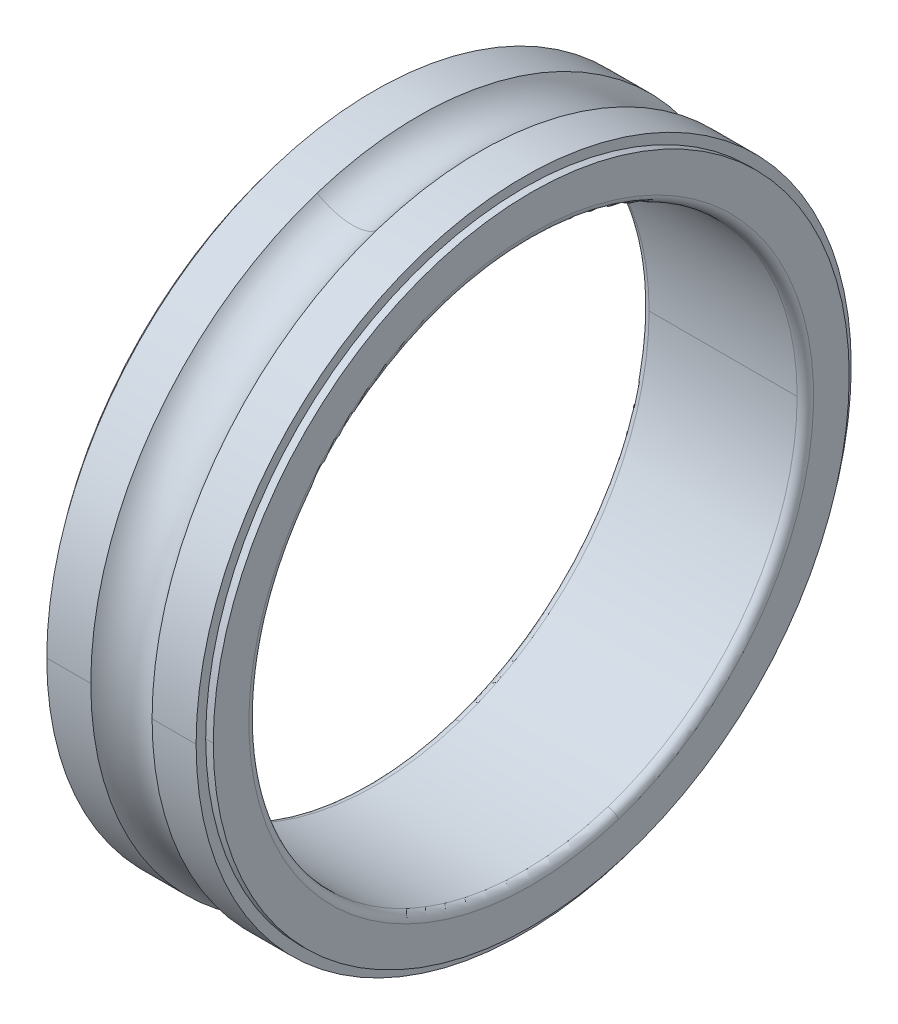
ISO-10303-21;
HEADER;
FILE_DESCRIPTION(('STEP AP214'),'2;1');
FILE_NAME('part.step','',(''),(''),'','','');
FILE_SCHEMA(('AUTOMOTIVE_DESIGN { 1 0 10303 214 1 1 1 1 }'));
ENDSEC;
DATA;
#1=APPLICATION_CONTEXT('core data for automotive mechanical design processes');
#2=APPLICATION_PROTOCOL_DEFINITION('international standard','automotive_design',2000,#1);
#3=PRODUCT_CONTEXT('',#1,'mechanical');
#4=PRODUCT('Part','Part','',(#3));
#5=PRODUCT_RELATED_PRODUCT_CATEGORY('part','',(#4));
#6=PRODUCT_DEFINITION_FORMATION('','',#4);
#7=PRODUCT_DEFINITION_CONTEXT('part definition',#1,'design');
#8=PRODUCT_DEFINITION('design','',#6,#7);
#9=PRODUCT_DEFINITION_SHAPE('','',#8);
#10=(LENGTH_UNIT() NAMED_UNIT(*) SI_UNIT(.MILLI.,.METRE.));
#11=(NAMED_UNIT(*) PLANE_ANGLE_UNIT() SI_UNIT($,.RADIAN.));
#12=(NAMED_UNIT(*) SI_UNIT($,.STERADIAN.) SOLID_ANGLE_UNIT());
#13=UNCERTAINTY_MEASURE_WITH_UNIT(LENGTH_MEASURE(1.E-05),#10,'distance_accuracy_value','');
#14=(GEOMETRIC_REPRESENTATION_CONTEXT(3) GLOBAL_UNCERTAINTY_ASSIGNED_CONTEXT((#13)) GLOBAL_UNIT_ASSIGNED_CONTEXT((#10,
#11,#12)) REPRESENTATION_CONTEXT('',''));
#15=CARTESIAN_POINT('',(0.,0.,0.));
#16=DIRECTION('',(0.,0.,1.));
#17=DIRECTION('',(1.,0.,0.));
#18=AXIS2_PLACEMENT_3D('',#15,#16,#17);
#19=CARTESIAN_POINT('',(0.,23.2,0.));
#20=DIRECTION('',(-1.,0.,0.));
#21=DIRECTION('',(0.,0.,1.));
#22=AXIS2_PLACEMENT_3D('',#19,#20,#21);
#23=PLANE('',#22);
#24=CARTESIAN_POINT('',(0.,0.,0.));
#25=DIRECTION('',(1.,0.,0.));
#26=DIRECTION('',(0.,0.,-1.));
#27=AXIS2_PLACEMENT_3D('',#24,#25,#26);
#28=CIRCLE('',#27,20.6);
#29=CARTESIAN_POINT('',(0.,19.5917642356802,6.36575008412392));
#30=VERTEX_POINT('',#29);
#31=CARTESIAN_POINT('',(0.,-19.5917642356802,-6.36575008412391));
#32=VERTEX_POINT('',#31);
#33=EDGE_CURVE('E11',#30,#32,#28,.T.);
#34=ORIENTED_EDGE('',*,*,#33,.T.);
#35=CARTESIAN_POINT('',(0.,-19.5917642356802,-6.36575008412391));
#36=CARTESIAN_POINT('',(0.,-18.5917939374484,-9.44318841882153));
#37=CARTESIAN_POINT('',(0.,-16.9878189121259,-12.3244696761459));
#38=CARTESIAN_POINT('',(0.,-14.8301439081799,-14.8506463708877));
#39=CARTESIAN_POINT('',(0.,-9.64059307015196,-18.9207220201268));
#40=CARTESIAN_POINT('',(0.,-3.29748713005487,-20.7268471819803));
#41=CARTESIAN_POINT('',(0.,0.0144982221817608,-20.9875117299781));
#42=CARTESIAN_POINT('',(0.,6.56204077262533,-20.1958848561819));
#43=CARTESIAN_POINT('',(0.,12.3244205690632,-16.9877755003788));
#44=CARTESIAN_POINT('',(0.,14.8506582270348,-14.8301573053641));
#45=CARTESIAN_POINT('',(0.,18.9207249957623,-9.64058723013851));
#46=CARTESIAN_POINT('',(0.,20.7268293745621,-3.29748541289759));
#47=CARTESIAN_POINT('',(0.,20.9875757152384,0.0144840105020361));
#48=CARTESIAN_POINT('',(0.,20.5916441385153,3.28828237818147));
#49=CARTESIAN_POINT('',(0.,19.5917642356802,6.36575008412391));
#50=B_SPLINE_CURVE_WITH_KNOTS('',5,(#35,#36,#37,#38,#39,#40,#41,#42,#43,#44,#45,#46,#47,#48,
#49),.UNSPECIFIED.,.F.,.F.,(6,3,3,3,6),(0.,0.785398163397448,1.5707963267949,2.35619449019234,
3.14159265358979),.UNSPECIFIED.);
#51=EDGE_CURVE('E26',#32,#30,#50,.T.);
#52=ORIENTED_EDGE('',*,*,#51,.T.);
#53=EDGE_LOOP('',(#34,#52));
#54=FACE_BOUND('',#53,.T.);
#55=CARTESIAN_POINT('',(0.,0.,0.));
#56=DIRECTION('',(1.,0.,0.));
#57=DIRECTION('',(0.,0.,-1.));
#58=AXIS2_PLACEMENT_3D('',#55,#56,#57);
#59=CIRCLE('',#58,23.2);
#60=CARTESIAN_POINT('',(0.,0.,23.2));
#61=VERTEX_POINT('',#60);
#62=CARTESIAN_POINT('',(0.,0.,-23.2));
#63=VERTEX_POINT('',#62);
#64=EDGE_CURVE('E400',#61,#63,#59,.T.);
#65=ORIENTED_EDGE('',*,*,#64,.F.);
#66=CARTESIAN_POINT('',(0.,0.,0.));
#67=DIRECTION('',(1.,0.,0.));
#68=DIRECTION('',(0.,0.,-1.));
#69=AXIS2_PLACEMENT_3D('',#66,#67,#68);
#70=CIRCLE('',#69,23.2);
#71=EDGE_CURVE('E395',#63,#61,#70,.T.);
#72=ORIENTED_EDGE('',*,*,#71,.F.);
#73=EDGE_LOOP('',(#65,#72));
#74=FACE_BOUND('',#73,.T.);
#75=ADVANCED_FACE('F17',(#54,#74),#23,.T.);
#76=CARTESIAN_POINT('',(12.,0.,0.));
#77=DIRECTION('',(1.,0.,0.));
#78=DIRECTION('',(0.,-1.,0.));
#79=AXIS2_PLACEMENT_3D('',#76,#77,#78);
#80=CYLINDRICAL_SURFACE('',#79,23.2);
#81=DIRECTION('',(1.,0.,0.));
#82=VECTOR('',#81,1.);
#83=CARTESIAN_POINT('',(0.,0.,23.2));
#84=LINE('',#83,#82);
#85=CARTESIAN_POINT('',(0.552,0.,23.2));
#86=VERTEX_POINT('',#85);
#87=EDGE_CURVE('E391',#61,#86,#84,.T.);
#88=ORIENTED_EDGE('',*,*,#87,.T.);
#89=CARTESIAN_POINT('',(0.552,0.,0.));
#90=DIRECTION('',(1.,0.,0.));
#91=DIRECTION('',(0.,0.,-1.));
#92=AXIS2_PLACEMENT_3D('',#89,#90,#91);
#93=CIRCLE('',#92,23.2);
#94=CARTESIAN_POINT('',(0.552,0.,-23.2));
#95=VERTEX_POINT('',#94);
#96=EDGE_CURVE('E386',#95,#86,#93,.T.);
#97=ORIENTED_EDGE('',*,*,#96,.F.);
#98=DIRECTION('',(1.,0.,0.));
#99=VECTOR('',#98,1.);
#100=CARTESIAN_POINT('',(0.,0.,-23.2));
#101=LINE('',#100,#99);
#102=EDGE_CURVE('E381',#63,#95,#101,.T.);
#103=ORIENTED_EDGE('',*,*,#102,.F.);
#104=ORIENTED_EDGE('',*,*,#71,.T.);
#105=EDGE_LOOP('',(#88,#97,#103,#104));
#106=FACE_BOUND('',#105,.T.);
#107=ADVANCED_FACE('F421',(#106),#80,.T.);
#108=CARTESIAN_POINT('',(12.,0.,0.));
#109=DIRECTION('',(1.,0.,0.));
#110=DIRECTION('',(0.,1.,0.));
#111=AXIS2_PLACEMENT_3D('',#108,#109,#110);
#112=CYLINDRICAL_SURFACE('',#111,23.2);
#113=ORIENTED_EDGE('',*,*,#87,.F.);
#114=ORIENTED_EDGE('',*,*,#64,.T.);
#115=ORIENTED_EDGE('',*,*,#102,.T.);
#116=CARTESIAN_POINT('',(0.552,0.,0.));
#117=DIRECTION('',(1.,0.,0.));
#118=DIRECTION('',(0.,0.,-1.));
#119=AXIS2_PLACEMENT_3D('',#116,#117,#118);
#120=CIRCLE('',#119,23.2);
#121=EDGE_CURVE('E376',#86,#95,#120,.T.);
#122=ORIENTED_EDGE('',*,*,#121,.F.);
#123=EDGE_LOOP('',(#113,#114,#115,#122));
#124=FACE_BOUND('',#123,.T.);
#125=ADVANCED_FACE('F416',(#124),#112,.T.);
#126=CARTESIAN_POINT('',(0.552,23.9,0.));
#127=DIRECTION('',(-1.,0.,0.));
#128=DIRECTION('',(0.,0.,1.));
#129=AXIS2_PLACEMENT_3D('',#126,#127,#128);
#130=PLANE('',#129);
#131=ORIENTED_EDGE('',*,*,#96,.T.);
#132=ORIENTED_EDGE('',*,*,#121,.T.);
#133=EDGE_LOOP('',(#131,#132));
#134=FACE_BOUND('',#133,.T.);
#135=CARTESIAN_POINT('',(0.552,0.,0.));
#136=DIRECTION('',(1.,0.,0.));
#137=DIRECTION('',(0.,0.,-1.));
#138=AXIS2_PLACEMENT_3D('',#135,#136,#137);
#139=CIRCLE('',#138,23.9);
#140=CARTESIAN_POINT('',(0.552,0.,23.9));
#141=VERTEX_POINT('',#140);
#142=CARTESIAN_POINT('',(0.552,0.,-23.9));
#143=VERTEX_POINT('',#142);
#144=EDGE_CURVE('E371',#141,#143,#139,.T.);
#145=ORIENTED_EDGE('',*,*,#144,.F.);
#146=CARTESIAN_POINT('',(0.552,0.,0.));
#147=DIRECTION('',(1.,0.,0.));
#148=DIRECTION('',(0.,0.,-1.));
#149=AXIS2_PLACEMENT_3D('',#146,#147,#148);
#150=CIRCLE('',#149,23.9);
#151=EDGE_CURVE('E366',#143,#141,#150,.T.);
#152=ORIENTED_EDGE('',*,*,#151,.F.);
#153=EDGE_LOOP('',(#145,#152));
#154=FACE_BOUND('',#153,.T.);
#155=ADVANCED_FACE('F423',(#134,#154),#130,.T.);
#156=CARTESIAN_POINT('',(12.,0.,0.));
#157=DIRECTION('',(1.,0.,0.));
#158=DIRECTION('',(0.,-1.,0.));
#159=AXIS2_PLACEMENT_3D('',#156,#157,#158);
#160=CYLINDRICAL_SURFACE('',#159,23.9);
#161=DIRECTION('',(1.,0.,0.));
#162=VECTOR('',#161,1.);
#163=CARTESIAN_POINT('',(0.552,0.,23.9));
#164=LINE('',#163,#162);
#165=CARTESIAN_POINT('',(3.7633730753655,0.,23.9));
#166=VERTEX_POINT('',#165);
#167=EDGE_CURVE('E362',#141,#166,#164,.T.);
#168=ORIENTED_EDGE('',*,*,#167,.T.);
#169=CARTESIAN_POINT('',(3.7633730753655,0.,0.));
#170=DIRECTION('',(1.,0.,0.));
#171=DIRECTION('',(0.,0.,-1.));
#172=AXIS2_PLACEMENT_3D('',#169,#170,#171);
#173=CIRCLE('',#172,23.9);
#174=CARTESIAN_POINT('',(3.7633730753655,22.7302507394542,7.38550616556124));
#175=VERTEX_POINT('',#174);
#176=EDGE_CURVE('E357',#175,#166,#173,.T.);
#177=ORIENTED_EDGE('',*,*,#176,.F.);
#178=CARTESIAN_POINT('',(3.7633730753655,0.,0.));
#179=DIRECTION('',(1.,0.,0.));
#180=DIRECTION('',(0.,0.,-1.));
#181=AXIS2_PLACEMENT_3D('',#178,#179,#180);
#182=CIRCLE('',#181,23.9);
#183=CARTESIAN_POINT('',(3.7633730753655,0.,-23.9));
#184=VERTEX_POINT('',#183);
#185=EDGE_CURVE('E352',#184,#175,#182,.T.);
#186=ORIENTED_EDGE('',*,*,#185,.F.);
#187=DIRECTION('',(1.,0.,0.));
#188=VECTOR('',#187,1.);
#189=CARTESIAN_POINT('',(0.552000000000003,0.,-23.9));
#190=LINE('',#189,#188);
#191=EDGE_CURVE('E347',#143,#184,#190,.T.);
#192=ORIENTED_EDGE('',*,*,#191,.F.);
#193=ORIENTED_EDGE('',*,*,#151,.T.);
#194=EDGE_LOOP('',(#168,#177,#186,#192,#193));
#195=FACE_BOUND('',#194,.T.);
#196=ADVANCED_FACE('F426',(#195),#160,.T.);
#197=CARTESIAN_POINT('',(12.,0.,0.));
#198=DIRECTION('',(1.,0.,0.));
#199=DIRECTION('',(0.,1.,0.));
#200=AXIS2_PLACEMENT_3D('',#197,#198,#199);
#201=CYLINDRICAL_SURFACE('',#200,23.9);
#202=ORIENTED_EDGE('',*,*,#167,.F.);
#203=ORIENTED_EDGE('',*,*,#144,.T.);
#204=ORIENTED_EDGE('',*,*,#191,.T.);
#205=CARTESIAN_POINT('',(3.7633730753655,0.,0.));
#206=DIRECTION('',(1.,0.,0.));
#207=DIRECTION('',(0.,0.,-1.));
#208=AXIS2_PLACEMENT_3D('',#205,#206,#207);
#209=CIRCLE('',#208,23.9);
#210=CARTESIAN_POINT('',(3.7633730753655,-22.7302507394542,-7.38550616556124));
#211=VERTEX_POINT('',#210);
#212=EDGE_CURVE('E342',#211,#184,#209,.T.);
#213=ORIENTED_EDGE('',*,*,#212,.F.);
#214=CARTESIAN_POINT('',(3.7633730753655,0.,0.));
#215=DIRECTION('',(1.,0.,0.));
#216=DIRECTION('',(0.,0.,-1.));
#217=AXIS2_PLACEMENT_3D('',#214,#215,#216);
#218=CIRCLE('',#217,23.9);
#219=EDGE_CURVE('E337',#166,#211,#218,.T.);
#220=ORIENTED_EDGE('',*,*,#219,.F.);
#221=EDGE_LOOP('',(#202,#203,#204,#213,#220));
#222=FACE_BOUND('',#221,.T.);
#223=ADVANCED_FACE('F432',(#222),#201,.T.);
#224=CARTESIAN_POINT('',(6.,0.,0.));
#225=DIRECTION('',(1.,0.,0.));
#226=DIRECTION('',(0.,0.309016994374947,-0.951056516295154));
#227=AXIS2_PLACEMENT_3D('',#224,#225,#226);
#228=TOROIDAL_SURFACE('',#227,25.5,2.75);
#229=CARTESIAN_POINT('',(6.,-24.2519411655264,-7.87993335656115));
#230=DIRECTION('',(0.,0.309016994374947,-0.951056516295154));
#231=DIRECTION('',(-0.813318881685273,0.553341973117182,0.179791705818152));
#232=AXIS2_PLACEMENT_3D('',#229,#230,#231);
#233=CIRCLE('',#232,2.75);
#234=CARTESIAN_POINT('',(8.23662692463451,-22.7302507394542,-7.38550616556124));
#235=VERTEX_POINT('',#234);
#236=EDGE_CURVE('E333',#211,#235,#233,.T.);
#237=ORIENTED_EDGE('',*,*,#236,.T.);
#238=CARTESIAN_POINT('',(8.2366269246345,0.,0.));
#239=DIRECTION('',(1.,0.,0.));
#240=DIRECTION('',(0.,0.,-1.));
#241=AXIS2_PLACEMENT_3D('',#238,#239,#240);
#242=CIRCLE('',#241,23.9);
#243=CARTESIAN_POINT('',(8.2366269246345,0.,23.9));
#244=VERTEX_POINT('',#243);
#245=EDGE_CURVE('E328',#244,#235,#242,.T.);
#246=ORIENTED_EDGE('',*,*,#245,.F.);
#247=CARTESIAN_POINT('',(8.2366269246345,0.,0.));
#248=DIRECTION('',(1.,0.,0.));
#249=DIRECTION('',(0.,0.,-1.));
#250=AXIS2_PLACEMENT_3D('',#247,#248,#249);
#251=CIRCLE('',#250,23.9);
#252=CARTESIAN_POINT('',(8.23662692463451,22.7302507394542,7.38550616556124));
#253=VERTEX_POINT('',#252);
#254=EDGE_CURVE('E323',#253,#244,#251,.T.);
#255=ORIENTED_EDGE('',*,*,#254,.F.);
#256=CARTESIAN_POINT('',(6.,24.2519411655264,7.87993335656116));
#257=DIRECTION('',(0.,-0.309016994374947,0.951056516295154));
#258=DIRECTION('',(-0.813318881685273,-0.553341973117182,-0.179791705818152));
#259=AXIS2_PLACEMENT_3D('',#256,#257,#258);
#260=CIRCLE('',#259,2.75);
#261=EDGE_CURVE('E318',#175,#253,#260,.T.);
#262=ORIENTED_EDGE('',*,*,#261,.F.);
#263=ORIENTED_EDGE('',*,*,#176,.T.);
#264=ORIENTED_EDGE('',*,*,#219,.T.);
#265=EDGE_LOOP('',(#237,#246,#255,#262,#263,#264));
#266=FACE_BOUND('',#265,.T.);
#267=ADVANCED_FACE('F439',(#266),#228,.F.);
#268=CARTESIAN_POINT('',(6.,0.,0.));
#269=DIRECTION('',(1.,0.,0.));
#270=DIRECTION('',(0.,-0.309016994374947,0.951056516295154));
#271=AXIS2_PLACEMENT_3D('',#268,#269,#270);
#272=TOROIDAL_SURFACE('',#271,25.5,2.75);
#273=ORIENTED_EDGE('',*,*,#236,.F.);
#274=ORIENTED_EDGE('',*,*,#212,.T.);
#275=ORIENTED_EDGE('',*,*,#185,.T.);
#276=ORIENTED_EDGE('',*,*,#261,.T.);
#277=CARTESIAN_POINT('',(8.2366269246345,0.,0.));
#278=DIRECTION('',(1.,0.,0.));
#279=DIRECTION('',(0.,0.,-1.));
#280=AXIS2_PLACEMENT_3D('',#277,#278,#279);
#281=CIRCLE('',#280,23.9);
#282=CARTESIAN_POINT('',(8.2366269246345,0.,-23.9));
#283=VERTEX_POINT('',#282);
#284=EDGE_CURVE('E313',#283,#253,#281,.T.);
#285=ORIENTED_EDGE('',*,*,#284,.F.);
#286=CARTESIAN_POINT('',(8.2366269246345,0.,0.));
#287=DIRECTION('',(1.,0.,0.));
#288=DIRECTION('',(0.,0.,-1.));
#289=AXIS2_PLACEMENT_3D('',#286,#287,#288);
#290=CIRCLE('',#289,23.9);
#291=EDGE_CURVE('E308',#235,#283,#290,.T.);
#292=ORIENTED_EDGE('',*,*,#291,.F.);
#293=EDGE_LOOP('',(#273,#274,#275,#276,#285,#292));
#294=FACE_BOUND('',#293,.T.);
#295=ADVANCED_FACE('F436',(#294),#272,.F.);
#296=CARTESIAN_POINT('',(12.,0.,0.));
#297=DIRECTION('',(1.,0.,0.));
#298=DIRECTION('',(0.,1.,0.));
#299=AXIS2_PLACEMENT_3D('',#296,#297,#298);
#300=CYLINDRICAL_SURFACE('',#299,23.9);
#301=DIRECTION('',(1.,0.,0.));
#302=VECTOR('',#301,1.);
#303=CARTESIAN_POINT('',(8.2366269246345,0.,23.9));
#304=LINE('',#303,#302);
#305=CARTESIAN_POINT('',(11.448,0.,23.9));
#306=VERTEX_POINT('',#305);
#307=EDGE_CURVE('E303',#244,#306,#304,.T.);
#308=ORIENTED_EDGE('',*,*,#307,.F.);
#309=ORIENTED_EDGE('',*,*,#245,.T.);
#310=ORIENTED_EDGE('',*,*,#291,.T.);
#311=DIRECTION('',(1.,0.,0.));
#312=VECTOR('',#311,1.);
#313=CARTESIAN_POINT('',(8.2366269246345,0.,-23.9));
#314=LINE('',#313,#312);
#315=CARTESIAN_POINT('',(11.448,0.,-23.9));
#316=VERTEX_POINT('',#315);
#317=EDGE_CURVE('E299',#283,#316,#314,.T.);
#318=ORIENTED_EDGE('',*,*,#317,.T.);
#319=CARTESIAN_POINT('',(11.448,0.,0.));
#320=DIRECTION('',(1.,0.,0.));
#321=DIRECTION('',(0.,0.,-1.));
#322=AXIS2_PLACEMENT_3D('',#319,#320,#321);
#323=CIRCLE('',#322,23.9);
#324=EDGE_CURVE('E294',#306,#316,#323,.T.);
#325=ORIENTED_EDGE('',*,*,#324,.F.);
#326=EDGE_LOOP('',(#308,#309,#310,#318,#325));
#327=FACE_BOUND('',#326,.T.);
#328=ADVANCED_FACE('F445',(#327),#300,.T.);
#329=CARTESIAN_POINT('',(11.448,23.2,0.));
#330=DIRECTION('',(1.,0.,0.));
#331=DIRECTION('',(0.,0.,-1.));
#332=AXIS2_PLACEMENT_3D('',#329,#330,#331);
#333=PLANE('',#332);
#334=CARTESIAN_POINT('',(11.448,0.,0.));
#335=DIRECTION('',(1.,0.,0.));
#336=DIRECTION('',(0.,0.,-1.));
#337=AXIS2_PLACEMENT_3D('',#334,#335,#336);
#338=CIRCLE('',#337,23.9);
#339=EDGE_CURVE('E289',#316,#306,#338,.T.);
#340=ORIENTED_EDGE('',*,*,#339,.T.);
#341=ORIENTED_EDGE('',*,*,#324,.T.);
#342=EDGE_LOOP('',(#340,#341));
#343=FACE_BOUND('',#342,.T.);
#344=CARTESIAN_POINT('',(11.448,0.,0.));
#345=DIRECTION('',(1.,0.,0.));
#346=DIRECTION('',(0.,0.,-1.));
#347=AXIS2_PLACEMENT_3D('',#344,#345,#346);
#348=CIRCLE('',#347,23.2);
#349=CARTESIAN_POINT('',(11.448,0.,23.2));
#350=VERTEX_POINT('',#349);
#351=CARTESIAN_POINT('',(11.448,0.,-23.2));
#352=VERTEX_POINT('',#351);
#353=EDGE_CURVE('E284',#350,#352,#348,.T.);
#354=ORIENTED_EDGE('',*,*,#353,.F.);
#355=CARTESIAN_POINT('',(11.448,0.,0.));
#356=DIRECTION('',(1.,0.,0.));
#357=DIRECTION('',(0.,0.,-1.));
#358=AXIS2_PLACEMENT_3D('',#355,#356,#357);
#359=CIRCLE('',#358,23.2);
#360=EDGE_CURVE('E279',#352,#350,#359,.T.);
#361=ORIENTED_EDGE('',*,*,#360,.F.);
#362=EDGE_LOOP('',(#354,#361));
#363=FACE_BOUND('',#362,.T.);
#364=ADVANCED_FACE('F449',(#343,#363),#333,.T.);
#365=CARTESIAN_POINT('',(12.,0.,0.));
#366=DIRECTION('',(1.,0.,0.));
#367=DIRECTION('',(0.,-1.,0.));
#368=AXIS2_PLACEMENT_3D('',#365,#366,#367);
#369=CYLINDRICAL_SURFACE('',#368,23.2);
#370=DIRECTION('',(1.,0.,0.));
#371=VECTOR('',#370,1.);
#372=CARTESIAN_POINT('',(11.448,0.,23.2));
#373=LINE('',#372,#371);
#374=CARTESIAN_POINT('',(12.,0.,23.2));
#375=VERTEX_POINT('',#374);
#376=EDGE_CURVE('E275',#350,#375,#373,.T.);
#377=ORIENTED_EDGE('',*,*,#376,.T.);
#378=CARTESIAN_POINT('',(12.,0.,0.));
#379=DIRECTION('',(1.,0.,0.));
#380=DIRECTION('',(0.,0.,-1.));
#381=AXIS2_PLACEMENT_3D('',#378,#379,#380);
#382=CIRCLE('',#381,23.2);
#383=CARTESIAN_POINT('',(12.,0.,-23.2));
#384=VERTEX_POINT('',#383);
#385=EDGE_CURVE('E270',#384,#375,#382,.T.);
#386=ORIENTED_EDGE('',*,*,#385,.F.);
#387=DIRECTION('',(1.,0.,0.));
#388=VECTOR('',#387,1.);
#389=CARTESIAN_POINT('',(11.448,0.,-23.2));
#390=LINE('',#389,#388);
#391=EDGE_CURVE('E265',#352,#384,#390,.T.);
#392=ORIENTED_EDGE('',*,*,#391,.F.);
#393=ORIENTED_EDGE('',*,*,#360,.T.);
#394=EDGE_LOOP('',(#377,#386,#392,#393));
#395=FACE_BOUND('',#394,.T.);
#396=ADVANCED_FACE('F452',(#395),#369,.T.);
#397=CARTESIAN_POINT('',(12.,0.,0.));
#398=DIRECTION('',(1.,0.,0.));
#399=DIRECTION('',(0.,1.,0.));
#400=AXIS2_PLACEMENT_3D('',#397,#398,#399);
#401=CYLINDRICAL_SURFACE('',#400,23.2);
#402=ORIENTED_EDGE('',*,*,#376,.F.);
#403=ORIENTED_EDGE('',*,*,#353,.T.);
#404=ORIENTED_EDGE('',*,*,#391,.T.);
#405=CARTESIAN_POINT('',(12.,0.,0.));
#406=DIRECTION('',(1.,0.,0.));
#407=DIRECTION('',(0.,0.,-1.));
#408=AXIS2_PLACEMENT_3D('',#405,#406,#407);
#409=CIRCLE('',#408,23.2);
#410=EDGE_CURVE('E262',#375,#384,#409,.T.);
#411=ORIENTED_EDGE('',*,*,#410,.F.);
#412=EDGE_LOOP('',(#402,#403,#404,#411));
#413=FACE_BOUND('',#412,.T.);
#414=ADVANCED_FACE('F458',(#413),#401,.T.);
#415=CARTESIAN_POINT('',(12.,20.6,0.));
#416=DIRECTION('',(1.,0.,0.));
#417=DIRECTION('',(0.,0.,-1.));
#418=AXIS2_PLACEMENT_3D('',#415,#416,#417);
#419=PLANE('',#418);
#420=ORIENTED_EDGE('',*,*,#385,.T.);
#421=ORIENTED_EDGE('',*,*,#410,.T.);
#422=EDGE_LOOP('',(#420,#421));
#423=FACE_BOUND('',#422,.T.);
#424=CARTESIAN_POINT('',(12.,-19.5917642356799,-6.36575008412387));
#425=CARTESIAN_POINT('',(12.,-19.4876115883956,-6.68632211000307));
#426=CARTESIAN_POINT('',(12.,-19.3755778119485,-7.00433276208184));
#427=CARTESIAN_POINT('',(12.,-19.1360472793767,-7.63447637067119));
#428=CARTESIAN_POINT('',(12.,-19.008550523252,-7.94660932718179));
#429=CARTESIAN_POINT('',(12.,-18.7383933099735,-8.56424259666748));
#430=CARTESIAN_POINT('',(12.,-18.5957328528196,-8.86974290964258));
#431=CARTESIAN_POINT('',(12.,-18.2955940283703,-9.47337571683854));
#432=CARTESIAN_POINT('',(12.,-18.1381156610748,-9.7715082110594));
#433=CARTESIAN_POINT('',(12.,-17.8087198303239,-10.3596869386149));
#434=CARTESIAN_POINT('',(12.,-17.6368023668684,-10.6497331719496));
#435=CARTESIAN_POINT('',(12.,-17.2789426594696,-11.2210406885179));
#436=CARTESIAN_POINT('',(12.,-17.0930004155262,-11.5023019717515));
#437=CARTESIAN_POINT('',(12.,-16.7075390577245,-12.0553619896259));
#438=CARTESIAN_POINT('',(12.,-16.5080199438661,-12.3271607242666));
#439=CARTESIAN_POINT('',(12.,-16.0958855161287,-12.8606408621299));
#440=CARTESIAN_POINT('',(12.,-15.8832702022496,-13.1223222653524));
#441=CARTESIAN_POINT('',(12.,-15.4454555804713,-13.6349373258508));
#442=CARTESIAN_POINT('',(12.,-15.2202562725721,-13.8858709831267));
#443=CARTESIAN_POINT('',(12.,-14.757816188392,-14.3763860308689));
#444=CARTESIAN_POINT('',(12.,-14.5205754121112,-14.6159674213353));
#445=CARTESIAN_POINT('',(12.,-14.0346239247686,-15.0832007628246));
#446=CARTESIAN_POINT('',(12.,-13.7859132137069,-15.3108527138475));
#447=CARTESIAN_POINT('',(12.,-13.277621022746,-15.7536787429812));
#448=CARTESIAN_POINT('',(12.,-13.0180395428469,-15.9688528210919));
#449=CARTESIAN_POINT('',(12.,-12.4886311687179,-16.3862047311944));
#450=CARTESIAN_POINT('',(12.,-12.2188042744881,-16.5883825631861));
#451=CARTESIAN_POINT('',(12.,-11.669555108324,-16.9792549169461));
#452=CARTESIAN_POINT('',(12.,-11.3901328363897,-17.1679494387143));
#453=CARTESIAN_POINT('',(12.,-10.8223660675432,-17.5314005903963));
#454=CARTESIAN_POINT('',(12.,-10.534021570631,-17.70615722031));
#455=CARTESIAN_POINT('',(12.,-9.94910499897806,-18.0413115842548));
#456=CARTESIAN_POINT('',(12.,-9.65253292423729,-18.2017093182858));
#457=CARTESIAN_POINT('',(12.,-9.05187566503179,-18.5077594782746));
#458=CARTESIAN_POINT('',(12.,-8.74779048056706,-18.6534119042323));
#459=CARTESIAN_POINT('',(12.,-8.13283956975776,-18.9296205586229));
#460=CARTESIAN_POINT('',(12.,-7.82197384341319,-19.0601767870557));
#461=CARTESIAN_POINT('',(12.,-7.19421075160758,-19.3058785250066));
#462=CARTESIAN_POINT('',(12.,-6.87731338614655,-19.4210240345247));
#463=CARTESIAN_POINT('',(12.,-6.23825044961834,-19.6356269390283));
#464=CARTESIAN_POINT('',(12.,-5.91608487855117,-19.7350843340137));
#465=CARTESIAN_POINT('',(12.,-5.26726165588976,-19.9180714078761));
#466=CARTESIAN_POINT('',(12.,-4.94060400429552,-20.0016010867529));
#467=CARTESIAN_POINT('',(12.,-4.28358356747451,-20.1525314980853));
#468=CARTESIAN_POINT('',(12.,-3.95322078224773,-20.2199322305408));
#469=CARTESIAN_POINT('',(12.,-3.2895859510476,-20.3384423747623));
#470=CARTESIAN_POINT('',(12.,-2.95631390507426,-20.3895517865283));
#471=CARTESIAN_POINT('',(12.,-2.28766343393092,-20.4753561623214));
#472=CARTESIAN_POINT('',(12.,-1.95228500876094,-20.5100511263484));
#473=CARTESIAN_POINT('',(12.,-1.28022973522625,-20.562943023456));
#474=CARTESIAN_POINT('',(12.,-0.94355288686154,-20.5811399565367));
#475=CARTESIAN_POINT('',(12.,-0.269711850954533,-20.6009919537461));
#476=CARTESIAN_POINT('',(12.,0.067452336587768,-20.6026470178748));
#477=CARTESIAN_POINT('',(12.,0.741455792790091,-20.5894112899858));
#478=CARTESIAN_POINT('',(12.,1.07829506145011,-20.5745204979681));
#479=CARTESIAN_POINT('',(12.,1.75083720458603,-20.5282289310085));
#480=CARTESIAN_POINT('',(12.,2.08654007906193,-20.4968281560666));
#481=CARTESIAN_POINT('',(12.,2.75600069620089,-20.4175922704759));
#482=CARTESIAN_POINT('',(12.,3.08975843886396,-20.369757159827));
#483=CARTESIAN_POINT('',(12.,3.75452474074146,-20.2577678417938));
#484=CARTESIAN_POINT('',(12.,4.08553329995589,-20.1936136344095));
#485=CARTESIAN_POINT('',(12.,4.74400380632405,-20.04914067601));
#486=CARTESIAN_POINT('',(12.,5.07146575347778,-19.9688219249949));
#487=CARTESIAN_POINT('',(12.,5.72205415121155,-19.7922133742404));
#488=CARTESIAN_POINT('',(12.,6.0451806017916,-19.6959235745009));
#489=CARTESIAN_POINT('',(12.,6.68631956645603,-19.487604896859));
#490=CARTESIAN_POINT('',(12.,7.00433208054042,-19.3755760189567));
#491=CARTESIAN_POINT('',(12.,7.6344770522125,-19.1360490723685));
#492=CARTESIAN_POINT('',(12.,7.94660950980019,-19.0085510036828));
#493=CARTESIAN_POINT('',(12.,8.56424241404897,-18.7383928295428));
#494=CARTESIAN_POINT('',(12.,8.86974286071007,-18.5957327240886));
#495=CARTESIAN_POINT('',(12.,9.47337576577096,-18.2955941571013));
#496=CARTESIAN_POINT('',(12.,9.77150822417076,-18.1381156955682));
#497=CARTESIAN_POINT('',(12.,10.3596869255035,-17.8087197958306));
#498=CARTESIAN_POINT('',(12.,10.6497331684364,-17.636802357626));
#499=CARTESIAN_POINT('',(12.,11.2210406920311,-17.2789426687121));
#500=CARTESIAN_POINT('',(12.,11.5023019726928,-17.0930004180028));
#501=CARTESIAN_POINT('',(12.,12.0553619886845,-16.707539055248));
#502=CARTESIAN_POINT('',(12.,12.3271607240144,-16.5080199432026));
#503=CARTESIAN_POINT('',(12.,12.8606408623821,-16.0958855167923));
#504=CARTESIAN_POINT('',(12.,13.12232226542,-15.8832702024274));
#505=CARTESIAN_POINT('',(12.,13.6349373257832,-15.4454555802935));
#506=CARTESIAN_POINT('',(12.,13.8858709831085,-15.2202562725245));
#507=CARTESIAN_POINT('',(12.,14.376386030887,-14.7578161884397));
#508=CARTESIAN_POINT('',(12.,14.6159674213401,-14.520575412124));
#509=CARTESIAN_POINT('',(12.,15.0832007628197,-14.0346239247559));
#510=CARTESIAN_POINT('',(12.,15.3108527138462,-13.7859132137035));
#511=CARTESIAN_POINT('',(12.,15.7536787429824,-13.2776210227495));
#512=CARTESIAN_POINT('',(12.,15.9688528210922,-13.0180395428479));
#513=CARTESIAN_POINT('',(12.,16.386204731194,-12.4886311687171));
#514=CARTESIAN_POINT('',(12.,16.588382563186,-12.2188042744879));
#515=CARTESIAN_POINT('',(12.,16.9792549169461,-11.6695551083243));
#516=CARTESIAN_POINT('',(12.,17.1679494387143,-11.3901328363898));
#517=CARTESIAN_POINT('',(12.,17.5314005903962,-10.8223660675432));
#518=CARTESIAN_POINT('',(12.,17.70615722031,-10.5340215706311));
#519=CARTESIAN_POINT('',(12.,18.0413115842547,-9.94910499897814));
#520=CARTESIAN_POINT('',(12.,18.2017093182857,-9.65253292423735));
#521=CARTESIAN_POINT('',(12.,18.5077594782745,-9.05187566503185));
#522=CARTESIAN_POINT('',(12.,18.6534119042323,-8.74779048056712));
#523=CARTESIAN_POINT('',(12.,18.9296205586229,-8.13283956975781));
#524=CARTESIAN_POINT('',(12.,19.0601767870557,-7.82197384341322));
#525=CARTESIAN_POINT('',(12.,19.3058785250065,-7.19421075160765));
#526=CARTESIAN_POINT('',(12.,19.4210240345244,-6.87731338614667));
#527=CARTESIAN_POINT('',(12.,19.6356269390285,-6.23825044961832));
#528=CARTESIAN_POINT('',(12.,19.7350843340147,-5.91608487855096));
#529=CARTESIAN_POINT('',(12.,19.9180714078751,-5.26726165589007));
#530=CARTESIAN_POINT('',(12.,20.0016010867494,-4.94060400429654));
#531=CARTESIAN_POINT('',(12.,20.1525314980888,-4.2835835674736));
#532=CARTESIAN_POINT('',(12.,20.2199322305539,-3.95322078224421));
#533=CARTESIAN_POINT('',(12.,20.3384423747491,-3.28958595105124));
#534=CARTESIAN_POINT('',(12.,20.3895517864791,-2.95631390508767));
#535=CARTESIAN_POINT('',(12.,20.4753561623705,-2.28766343391763));
#536=CARTESIAN_POINT('',(12.,20.5100511265319,-1.95228500871117));
#537=CARTESIAN_POINT('',(12.,20.5629430232724,-1.28022973527615));
#538=CARTESIAN_POINT('',(12.,20.5811399558516,-0.94355288704759));
#539=CARTESIAN_POINT('',(12.,20.6009919544312,-0.269711850768625));
#540=CARTESIAN_POINT('',(12.,20.6026470204316,0.0674523372817826));
#541=CARTESIAN_POINT('',(12.,20.5894112874289,0.741455792095938));
#542=CARTESIAN_POINT('',(12.,20.5745204884258,1.07829505885969));
#543=CARTESIAN_POINT('',(12.,20.5282289405508,1.75083720717632));
#544=CARTESIAN_POINT('',(12.,20.496828191679,2.08654008872921));
#545=CARTESIAN_POINT('',(12.,20.4175922348635,2.7560006865335));
#546=CARTESIAN_POINT('',(12.,20.3697570269197,3.08975840278491));
#547=CARTESIAN_POINT('',(12.,20.2577679747012,3.75452477682041));
#548=CARTESIAN_POINT('',(12.,20.1936141304265,4.0855334346045));
#549=CARTESIAN_POINT('',(12.,20.049140179993,4.74400367167535));
#550=CARTESIAN_POINT('',(12.,19.9688200738341,5.07146525096211));
#551=CARTESIAN_POINT('',(12.,19.7922152254012,5.72205465372712));
#552=CARTESIAN_POINT('',(12.,19.6959304831271,6.04518247720537));
#553=CARTESIAN_POINT('',(12.,19.5917642356799,6.36575008412376));
#554=B_SPLINE_CURVE_WITH_KNOTS('',3,(#424,#425,#426,#427,#428,#429,#430,#431,#432,#433,#434,
#435,#436,#437,#438,#439,#440,#441,#442,#443,#444,#445,#446,#447,#448,#449,#450,#451,#452,#453,
#454,#455,#456,#457,#458,#459,#460,#461,#462,#463,#464,#465,#466,#467,#468,#469,#470,#471,#472,
#473,#474,#475,#476,#477,#478,#479,#480,#481,#482,#483,#484,#485,#486,#487,#488,#489,#490,#491,
#492,#493,#494,#495,#496,#497,#498,#499,#500,#501,#502,#503,#504,#505,#506,#507,#508,#509,#510,
#511,#512,#513,#514,#515,#516,#517,#518,#519,#520,#521,#522,#523,#524,#525,#526,#527,#528,#529,
#530,#531,#532,#533,#534,#535,#536,#537,#538,#539,#540,#541,#542,#543,#544,#545,#546,#547,#548,
#549,#550,#551,#552,#553),.UNSPECIFIED.,.F.,.F.,(4,2,2,2,2,2,2,2,2,2,2,2,2,2,2,2,2,2,2,2,2,2,2,
2,2,2,2,2,2,2,2,2,2,2,2,2,2,2,2,2,2,2,2,2,2,2,2,2,2,2,2,2,2,2,2,2,2,2,2,2,2,2,2,2,4),(0.,
1.01109861514397,2.02219723028795,3.03329584543192,4.04439446057589,5.05549307571986,
6.06659169086383,7.0776903060078,8.08878892115178,9.09988753629575,10.1109861514397,
11.1220847665837,12.1331833817277,13.1442819968716,14.1553806120156,15.1664792271596,
16.1775778423036,17.1886764574475,18.1997750725915,19.2108736877355,20.2219723028794,
21.2330709180234,22.2441695331674,23.2552681483114,24.2663667634553,25.2774653785993,
26.2885639937433,27.2996626088873,28.3107612240312,29.3218598391752,30.3329584543192,
31.3440570694631,32.3551556846071,33.3662542997511,34.3773529148951,35.388451530039,
36.399550145183,37.410648760327,38.421747375471,39.4328459906149,40.4439446057589,
41.4550432209029,42.4661418360469,43.4772404511908,44.4883390663348,45.4994376814788,
46.5105362966227,47.5216349117667,48.5327335269107,49.5438321420547,50.5549307571986,
51.5660293723426,52.5771279874866,53.5882266026306,54.5993252177745,55.6104238329185,
56.6215224480625,57.6326210632064,58.6437196783504,59.6548182934944,60.6659169086384,
61.6770155237823,62.6881141389263,63.6992127540703,64.7103113692143),.UNSPECIFIED.);
#555=CARTESIAN_POINT('',(12.,-19.5917642356799,-6.36575008412384));
#556=VERTEX_POINT('',#555);
#557=CARTESIAN_POINT('',(12.,19.5917642356799,6.36575008412384));
#558=VERTEX_POINT('',#557);
#559=EDGE_CURVE('E261',#556,#558,#554,.T.);
#560=ORIENTED_EDGE('',*,*,#559,.F.);
#561=CARTESIAN_POINT('',(12.,19.5917642356799,6.36575008412388));
#562=CARTESIAN_POINT('',(12.,19.4876115883956,6.68632211000307));
#563=CARTESIAN_POINT('',(12.,19.3755778119485,7.00433276208184));
#564=CARTESIAN_POINT('',(12.,19.1360472793767,7.6344763706712));
#565=CARTESIAN_POINT('',(12.,19.008550523252,7.94660932718179));
#566=CARTESIAN_POINT('',(12.,18.7383933099735,8.56424259666748));
#567=CARTESIAN_POINT('',(12.,18.5957328528196,8.86974290964258));
#568=CARTESIAN_POINT('',(12.,18.2955940283703,9.47337571683854));
#569=CARTESIAN_POINT('',(12.,18.1381156610748,9.7715082110594));
#570=CARTESIAN_POINT('',(12.,17.8087198303239,10.359686938615));
#571=CARTESIAN_POINT('',(12.,17.6368023668684,10.6497331719496));
#572=CARTESIAN_POINT('',(12.,17.2789426594696,11.2210406885179));
#573=CARTESIAN_POINT('',(12.,17.0930004155262,11.5023019717515));
#574=CARTESIAN_POINT('',(12.,16.7075390577245,12.0553619896259));
#575=CARTESIAN_POINT('',(12.,16.5080199438661,12.3271607242666));
#576=CARTESIAN_POINT('',(12.,16.0958855161287,12.8606408621299));
#577=CARTESIAN_POINT('',(12.,15.8832702022496,13.1223222653525));
#578=CARTESIAN_POINT('',(12.,15.4454555804713,13.6349373258508));
#579=CARTESIAN_POINT('',(12.,15.2202562725721,13.8858709831267));
#580=CARTESIAN_POINT('',(12.,14.757816188392,14.3763860308689));
#581=CARTESIAN_POINT('',(12.,14.5205754121112,14.6159674213353));
#582=CARTESIAN_POINT('',(12.,14.0346239247686,15.0832007628246));
#583=CARTESIAN_POINT('',(12.,13.7859132137069,15.3108527138475));
#584=CARTESIAN_POINT('',(12.,13.277621022746,15.7536787429812));
#585=CARTESIAN_POINT('',(12.,13.0180395428469,15.9688528210919));
#586=CARTESIAN_POINT('',(12.,12.4886311687179,16.3862047311944));
#587=CARTESIAN_POINT('',(12.,12.2188042744881,16.5883825631861));
#588=CARTESIAN_POINT('',(12.,11.669555108324,16.9792549169461));
#589=CARTESIAN_POINT('',(12.,11.3901328363897,17.1679494387143));
#590=CARTESIAN_POINT('',(12.,10.8223660675432,17.5314005903963));
#591=CARTESIAN_POINT('',(12.,10.534021570631,17.70615722031));
#592=CARTESIAN_POINT('',(12.,9.94910499897805,18.0413115842548));
#593=CARTESIAN_POINT('',(12.,9.65253292423728,18.2017093182858));
#594=CARTESIAN_POINT('',(12.,9.05187566503178,18.5077594782746));
#595=CARTESIAN_POINT('',(12.,8.74779048056705,18.6534119042323));
#596=CARTESIAN_POINT('',(12.,8.13283956975775,18.9296205586229));
#597=CARTESIAN_POINT('',(12.,7.82197384341318,19.0601767870557));
#598=CARTESIAN_POINT('',(12.,7.19421075160757,19.3058785250066));
#599=CARTESIAN_POINT('',(12.,6.87731338614653,19.4210240345247));
#600=CARTESIAN_POINT('',(12.,6.23825044961832,19.6356269390283));
#601=CARTESIAN_POINT('',(12.,5.91608487855115,19.7350843340137));
#602=CARTESIAN_POINT('',(12.,5.26726165588974,19.9180714078761));
#603=CARTESIAN_POINT('',(12.,4.9406040042955,20.0016010867529));
#604=CARTESIAN_POINT('',(12.,4.28358356747448,20.1525314980853));
#605=CARTESIAN_POINT('',(12.,3.9532207822477,20.2199322305408));
#606=CARTESIAN_POINT('',(12.,3.28958595104757,20.3384423747623));
#607=CARTESIAN_POINT('',(12.,2.95631390507422,20.3895517865283));
#608=CARTESIAN_POINT('',(12.,2.28766343393089,20.4753561623214));
#609=CARTESIAN_POINT('',(12.,1.9522850087609,20.5100511263484));
#610=CARTESIAN_POINT('',(12.,1.28022973522622,20.562943023456));
#611=CARTESIAN_POINT('',(12.,0.943552886861516,20.5811399565367));
#612=CARTESIAN_POINT('',(12.,0.26971185095451,20.6009919537461));
#613=CARTESIAN_POINT('',(12.,-0.0674523365877934,20.6026470178748));
#614=CARTESIAN_POINT('',(12.,-0.741455792790117,20.5894112899858));
#615=CARTESIAN_POINT('',(12.,-1.07829506145014,20.5745204979681));
#616=CARTESIAN_POINT('',(12.,-1.75083720458606,20.5282289310085));
#617=CARTESIAN_POINT('',(12.,-2.08654007906195,20.4968281560666));
#618=CARTESIAN_POINT('',(12.,-2.75600069620092,20.4175922704759));
#619=CARTESIAN_POINT('',(12.,-3.08975843886398,20.369757159827));
#620=CARTESIAN_POINT('',(12.,-3.75452474074149,20.2577678417938));
#621=CARTESIAN_POINT('',(12.,-4.08553329995592,20.1936136344095));
#622=CARTESIAN_POINT('',(12.,-4.74400380632409,20.04914067601));
#623=CARTESIAN_POINT('',(12.,-5.07146575347782,19.9688219249949));
#624=CARTESIAN_POINT('',(12.,-5.72205415121159,19.7922133742403));
#625=CARTESIAN_POINT('',(12.,-6.04518060179163,19.6959235745008));
#626=CARTESIAN_POINT('',(12.,-6.68631956645606,19.487604896859));
#627=CARTESIAN_POINT('',(12.,-7.00433208054045,19.3755760189566));
#628=CARTESIAN_POINT('',(12.,-7.63447705221253,19.1360490723685));
#629=CARTESIAN_POINT('',(12.,-7.94660950980022,19.0085510036828));
#630=CARTESIAN_POINT('',(12.,-8.564242414049,18.7383928295428));
#631=CARTESIAN_POINT('',(12.,-8.86974286071009,18.5957327240886));
#632=CARTESIAN_POINT('',(12.,-9.47337576577099,18.2955941571013));
#633=CARTESIAN_POINT('',(12.,-9.77150822417079,18.1381156955682));
#634=CARTESIAN_POINT('',(12.,-10.3596869255035,17.8087197958306));
#635=CARTESIAN_POINT('',(12.,-10.6497331684364,17.636802357626));
#636=CARTESIAN_POINT('',(12.,-11.2210406920311,17.2789426687121));
#637=CARTESIAN_POINT('',(12.,-11.5023019726928,17.0930004180028));
#638=CARTESIAN_POINT('',(12.,-12.0553619886845,16.707539055248));
#639=CARTESIAN_POINT('',(12.,-12.3271607240144,16.5080199432025));
#640=CARTESIAN_POINT('',(12.,-12.8606408623822,16.0958855167922));
#641=CARTESIAN_POINT('',(12.,-13.12232226542,15.8832702024274));
#642=CARTESIAN_POINT('',(12.,-13.6349373257832,15.4454555802935));
#643=CARTESIAN_POINT('',(12.,-13.8858709831086,15.2202562725244));
#644=CARTESIAN_POINT('',(12.,-14.376386030887,14.7578161884397));
#645=CARTESIAN_POINT('',(12.,-14.6159674213402,14.520575412124));
#646=CARTESIAN_POINT('',(12.,-15.0832007628197,14.0346239247559));
#647=CARTESIAN_POINT('',(12.,-15.3108527138462,13.7859132137035));
#648=CARTESIAN_POINT('',(12.,-15.7536787429824,13.2776210227495));
#649=CARTESIAN_POINT('',(12.,-15.9688528210923,13.0180395428478));
#650=CARTESIAN_POINT('',(12.,-16.386204731194,12.488631168717));
#651=CARTESIAN_POINT('',(12.,-16.588382563186,12.2188042744879));
#652=CARTESIAN_POINT('',(12.,-16.9792549169461,11.6695551083242));
#653=CARTESIAN_POINT('',(12.,-17.1679494387143,11.3901328363898));
#654=CARTESIAN_POINT('',(12.,-17.5314005903963,10.8223660675432));
#655=CARTESIAN_POINT('',(12.,-17.70615722031,10.534021570631));
#656=CARTESIAN_POINT('',(12.,-18.0413115842548,9.94910499897809));
#657=CARTESIAN_POINT('',(12.,-18.2017093182858,9.6525329242373));
#658=CARTESIAN_POINT('',(12.,-18.5077594782745,9.0518756650318));
#659=CARTESIAN_POINT('',(12.,-18.6534119042323,8.74779048056708));
#660=CARTESIAN_POINT('',(12.,-18.9296205586229,8.13283956975778));
#661=CARTESIAN_POINT('',(12.,-19.0601767870557,7.82197384341319));
#662=CARTESIAN_POINT('',(12.,-19.3058785250065,7.19421075160762));
#663=CARTESIAN_POINT('',(12.,-19.4210240345244,6.87731338614663));
#664=CARTESIAN_POINT('',(12.,-19.6356269390285,6.23825044961828));
#665=CARTESIAN_POINT('',(12.,-19.7350843340147,5.91608487855092));
#666=CARTESIAN_POINT('',(12.,-19.9180714078751,5.26726165589001));
#667=CARTESIAN_POINT('',(12.,-20.0016010867494,4.94060400429648));
#668=CARTESIAN_POINT('',(12.,-20.1525314980888,4.28358356747355));
#669=CARTESIAN_POINT('',(12.,-20.2199322305539,3.95322078224415));
#670=CARTESIAN_POINT('',(12.,-20.3384423747491,3.28958595105118));
#671=CARTESIAN_POINT('',(12.,-20.3895517864791,2.95631390508761));
#672=CARTESIAN_POINT('',(12.,-20.4753561623706,2.28766343391757));
#673=CARTESIAN_POINT('',(12.,-20.5100511265319,1.95228500871111));
#674=CARTESIAN_POINT('',(12.,-20.5629430232724,1.28022973527609));
#675=CARTESIAN_POINT('',(12.,-20.5811399558516,0.943552887047533));
#676=CARTESIAN_POINT('',(12.,-20.6009919544312,0.269711850768568));
#677=CARTESIAN_POINT('',(12.,-20.6026470204316,-0.0674523372818398));
#678=CARTESIAN_POINT('',(12.,-20.5894112874289,-0.741455792095995));
#679=CARTESIAN_POINT('',(12.,-20.5745204884258,-1.07829505885974));
#680=CARTESIAN_POINT('',(12.,-20.5282289405508,-1.75083720717638));
#681=CARTESIAN_POINT('',(12.,-20.496828191679,-2.08654008872927));
#682=CARTESIAN_POINT('',(12.,-20.4175922348635,-2.75600068653356));
#683=CARTESIAN_POINT('',(12.,-20.3697570269197,-3.08975840278497));
#684=CARTESIAN_POINT('',(12.,-20.2577679747012,-3.75452477682046));
#685=CARTESIAN_POINT('',(12.,-20.1936141304265,-4.08553343460455));
#686=CARTESIAN_POINT('',(12.,-20.049140179993,-4.7440036716754));
#687=CARTESIAN_POINT('',(12.,-19.9688200738341,-5.07146525096216));
#688=CARTESIAN_POINT('',(12.,-19.7922152254012,-5.72205465372717));
#689=CARTESIAN_POINT('',(12.,-19.6959304831271,-6.04518247720542));
#690=CARTESIAN_POINT('',(12.,-19.5917642356799,-6.36575008412382));
#691=B_SPLINE_CURVE_WITH_KNOTS('',3,(#561,#562,#563,#564,#565,#566,#567,#568,#569,#570,#571,
#572,#573,#574,#575,#576,#577,#578,#579,#580,#581,#582,#583,#584,#585,#586,#587,#588,#589,#590,
#591,#592,#593,#594,#595,#596,#597,#598,#599,#600,#601,#602,#603,#604,#605,#606,#607,#608,#609,
#610,#611,#612,#613,#614,#615,#616,#617,#618,#619,#620,#621,#622,#623,#624,#625,#626,#627,#628,
#629,#630,#631,#632,#633,#634,#635,#636,#637,#638,#639,#640,#641,#642,#643,#644,#645,#646,#647,
#648,#649,#650,#651,#652,#653,#654,#655,#656,#657,#658,#659,#660,#661,#662,#663,#664,#665,#666,
#667,#668,#669,#670,#671,#672,#673,#674,#675,#676,#677,#678,#679,#680,#681,#682,#683,#684,#685,
#686,#687,#688,#689,#690),.UNSPECIFIED.,.F.,.F.,(4,2,2,2,2,2,2,2,2,2,2,2,2,2,2,2,2,2,2,2,2,2,2,
2,2,2,2,2,2,2,2,2,2,2,2,2,2,2,2,2,2,2,2,2,2,2,2,2,2,2,2,2,2,2,2,2,2,2,2,2,2,2,2,2,4),(0.,
1.01109861514397,2.02219723028795,3.03329584543192,4.04439446057589,5.05549307571986,
6.06659169086384,7.07769030600781,8.08878892115179,9.09988753629576,10.1109861514397,
11.1220847665837,12.1331833817277,13.1442819968717,14.1553806120156,15.1664792271596,
16.1775778423036,17.1886764574475,18.1997750725915,19.2108736877355,20.2219723028795,
21.2330709180234,22.2441695331674,23.2552681483114,24.2663667634554,25.2774653785993,
26.2885639937433,27.2996626088873,28.3107612240312,29.3218598391752,30.3329584543192,
31.3440570694632,32.3551556846071,33.3662542997511,34.3773529148951,35.3884515300391,
36.399550145183,37.410648760327,38.421747375471,39.432845990615,40.4439446057589,
41.4550432209029,42.4661418360469,43.4772404511909,44.4883390663348,45.4994376814788,
46.5105362966228,47.5216349117668,48.5327335269107,49.5438321420547,50.5549307571987,
51.5660293723426,52.5771279874866,53.5882266026306,54.5993252177746,55.6104238329185,
56.6215224480625,57.6326210632065,58.6437196783505,59.6548182934944,60.6659169086384,
61.6770155237824,62.6881141389264,63.6992127540703,64.7103113692143),.UNSPECIFIED.);
#692=EDGE_CURVE('E224',#558,#556,#691,.T.);
#693=ORIENTED_EDGE('',*,*,#692,.F.);
#694=EDGE_LOOP('',(#560,#693));
#695=FACE_BOUND('',#694,.T.);
#696=ADVANCED_FACE('F209',(#423,#695),#419,.T.);
#697=CARTESIAN_POINT('',(11.4000000000002,0.,0.));
#698=DIRECTION('',(1.,0.,0.));
#699=DIRECTION('',(0.,0.309016994374947,-0.951056516295154));
#700=AXIS2_PLACEMENT_3D('',#697,#698,#699);
#701=TOROIDAL_SURFACE('',#700,20.5999999999997,0.599999999999754);
#702=CARTESIAN_POINT('',(11.4000000000002,-19.5917642356799,-6.36575008412384));
#703=DIRECTION('',(0.,0.309016994374949,-0.951056516295153));
#704=DIRECTION('',(-3.96719694132887E-13,0.951056516295153,0.309016994374949));
#705=AXIS2_PLACEMENT_3D('',#702,#703,#704);
#706=CIRCLE('',#705,0.599999999999752);
#707=CARTESIAN_POINT('',(11.4,-19.0211303259031,-6.18033988749894));
#708=VERTEX_POINT('',#707);
#709=EDGE_CURVE('E235',#708,#556,#706,.T.);
#710=ORIENTED_EDGE('',*,*,#709,.F.);
#711=CARTESIAN_POINT('',(11.4,0.,0.));
#712=DIRECTION('',(1.,0.,0.));
#713=DIRECTION('',(0.,0.,-1.));
#714=AXIS2_PLACEMENT_3D('',#711,#712,#713);
#715=CIRCLE('',#714,20.);
#716=CARTESIAN_POINT('',(11.4,0.,20.));
#717=VERTEX_POINT('',#716);
#718=EDGE_CURVE('E230',#717,#708,#715,.T.);
#719=ORIENTED_EDGE('',*,*,#718,.F.);
#720=CARTESIAN_POINT('',(11.4,0.,0.));
#721=DIRECTION('',(1.,0.,0.));
#722=DIRECTION('',(0.,0.,-1.));
#723=AXIS2_PLACEMENT_3D('',#720,#721,#722);
#724=CIRCLE('',#723,20.);
#725=CARTESIAN_POINT('',(11.4,19.0211303259031,6.18033988749895));
#726=VERTEX_POINT('',#725);
#727=EDGE_CURVE('E226',#726,#717,#724,.T.);
#728=ORIENTED_EDGE('',*,*,#727,.F.);
#729=CARTESIAN_POINT('',(11.4000000000002,19.5917642356799,6.36575008412384));
#730=DIRECTION('',(0.,-0.309016994374949,0.951056516295153));
#731=DIRECTION('',(-3.99680288865222E-13,-0.951056516295153,-0.309016994374949));
#732=AXIS2_PLACEMENT_3D('',#729,#730,#731);
#733=CIRCLE('',#732,0.599999999999752);
#734=EDGE_CURVE('E183',#726,#558,#733,.T.);
#735=ORIENTED_EDGE('',*,*,#734,.T.);
#736=ORIENTED_EDGE('',*,*,#692,.T.);
#737=EDGE_LOOP('',(#710,#719,#728,#735,#736));
#738=FACE_BOUND('',#737,.T.);
#739=ADVANCED_FACE('F203',(#738),#701,.T.);
#740=CARTESIAN_POINT('',(11.4000000000002,0.,0.));
#741=DIRECTION('',(1.,0.,0.));
#742=DIRECTION('',(0.,-0.309016994374947,0.951056516295154));
#743=AXIS2_PLACEMENT_3D('',#740,#741,#742);
#744=TOROIDAL_SURFACE('',#743,20.5999999999997,0.599999999999754);
#745=ORIENTED_EDGE('',*,*,#709,.T.);
#746=ORIENTED_EDGE('',*,*,#559,.T.);
#747=ORIENTED_EDGE('',*,*,#734,.F.);
#748=CARTESIAN_POINT('',(11.4,0.,0.));
#749=DIRECTION('',(1.,0.,0.));
#750=DIRECTION('',(0.,0.,-1.));
#751=AXIS2_PLACEMENT_3D('',#748,#749,#750);
#752=CIRCLE('',#751,20.);
#753=CARTESIAN_POINT('',(11.4,0.,-20.));
#754=VERTEX_POINT('',#753);
#755=EDGE_CURVE('E178',#754,#726,#752,.T.);
#756=ORIENTED_EDGE('',*,*,#755,.F.);
#757=CARTESIAN_POINT('',(11.4,0.,0.));
#758=DIRECTION('',(1.,0.,0.));
#759=DIRECTION('',(0.,0.,-1.));
#760=AXIS2_PLACEMENT_3D('',#757,#758,#759);
#761=CIRCLE('',#760,20.);
#762=EDGE_CURVE('E173',#708,#754,#761,.T.);
#763=ORIENTED_EDGE('',*,*,#762,.F.);
#764=EDGE_LOOP('',(#745,#746,#747,#756,#763));
#765=FACE_BOUND('',#764,.T.);
#766=ADVANCED_FACE('F192',(#765),#744,.T.);
#767=CARTESIAN_POINT('',(12.,0.,0.));
#768=DIRECTION('',(1.,0.,0.));
#769=DIRECTION('',(0.,1.,0.));
#770=AXIS2_PLACEMENT_3D('',#767,#768,#769);
#771=CYLINDRICAL_SURFACE('',#770,20.);
#772=DIRECTION('',(1.,0.,0.));
#773=VECTOR('',#772,1.);
#774=CARTESIAN_POINT('',(0.6,0.,20.));
#775=LINE('',#774,#773);
#776=CARTESIAN_POINT('',(0.6,0.,20.));
#777=VERTEX_POINT('',#776);
#778=EDGE_CURVE('E149',#777,#717,#775,.T.);
#779=ORIENTED_EDGE('',*,*,#778,.T.);
#780=ORIENTED_EDGE('',*,*,#718,.T.);
#781=ORIENTED_EDGE('',*,*,#762,.T.);
#782=DIRECTION('',(1.,0.,0.));
#783=VECTOR('',#782,1.);
#784=CARTESIAN_POINT('',(0.6,0.,-20.));
#785=LINE('',#784,#783);
#786=CARTESIAN_POINT('',(0.6,0.,-20.));
#787=VERTEX_POINT('',#786);
#788=EDGE_CURVE('E166',#787,#754,#785,.T.);
#789=ORIENTED_EDGE('',*,*,#788,.F.);
#790=CARTESIAN_POINT('',(0.6,0.,0.));
#791=DIRECTION('',(1.,0.,0.));
#792=DIRECTION('',(0.,0.,-1.));
#793=AXIS2_PLACEMENT_3D('',#790,#791,#792);
#794=CIRCLE('',#793,20.);
#795=CARTESIAN_POINT('',(0.600000000000001,-19.0211303259032,-6.18033988749898));
#796=VERTEX_POINT('',#795);
#797=EDGE_CURVE('E141',#796,#787,#794,.T.);
#798=ORIENTED_EDGE('',*,*,#797,.F.);
#799=CARTESIAN_POINT('',(0.6,0.,0.));
#800=DIRECTION('',(1.,0.,0.));
#801=DIRECTION('',(0.,0.,-1.));
#802=AXIS2_PLACEMENT_3D('',#799,#800,#801);
#803=CIRCLE('',#802,20.);
#804=EDGE_CURVE('E159',#777,#796,#803,.T.);
#805=ORIENTED_EDGE('',*,*,#804,.F.);
#806=EDGE_LOOP('',(#779,#780,#781,#789,#798,#805));
#807=FACE_BOUND('',#806,.T.);
#808=ADVANCED_FACE('F202',(#807),#771,.F.);
#809=CARTESIAN_POINT('',(0.599999999999874,0.,0.));
#810=DIRECTION('',(1.,0.,0.));
#811=DIRECTION('',(0.,0.309016994374947,-0.951056516295154));
#812=AXIS2_PLACEMENT_3D('',#809,#810,#811);
#813=TOROIDAL_SURFACE('',#812,20.6,0.599999999999874);
#814=CARTESIAN_POINT('',(0.599999999999874,-19.5917642356802,-6.36575008412391));
#815=DIRECTION('',(0.,0.309016994374947,-0.951056516295154));
#816=DIRECTION('',(-1.,0.,0.));
#817=AXIS2_PLACEMENT_3D('',#814,#815,#816);
#818=CIRCLE('',#817,0.599999999999874);
#819=EDGE_CURVE('E134',#32,#796,#818,.T.);
#820=ORIENTED_EDGE('',*,*,#819,.F.);
#821=ORIENTED_EDGE('',*,*,#33,.F.);
#822=CARTESIAN_POINT('',(0.599999999999874,19.5917642356802,6.36575008412392));
#823=DIRECTION('',(0.,-0.309016994374947,0.951056516295154));
#824=DIRECTION('',(-1.,0.,0.));
#825=AXIS2_PLACEMENT_3D('',#822,#823,#824);
#826=CIRCLE('',#825,0.599999999999874);
#827=CARTESIAN_POINT('',(0.600000000000001,19.0211303259032,6.18033988749899));
#828=VERTEX_POINT('',#827);
#829=EDGE_CURVE('E127',#30,#828,#826,.T.);
#830=ORIENTED_EDGE('',*,*,#829,.T.);
#831=CARTESIAN_POINT('',(0.6,0.,0.));
#832=DIRECTION('',(1.,0.,0.));
#833=DIRECTION('',(0.,0.,-1.));
#834=AXIS2_PLACEMENT_3D('',#831,#832,#833);
#835=CIRCLE('',#834,20.);
#836=EDGE_CURVE('E132',#828,#777,#835,.T.);
#837=ORIENTED_EDGE('',*,*,#836,.T.);
#838=ORIENTED_EDGE('',*,*,#804,.T.);
#839=EDGE_LOOP('',(#820,#821,#830,#837,#838));
#840=FACE_BOUND('',#839,.T.);
#841=ADVANCED_FACE('F129',(#840),#813,.T.);
#842=CARTESIAN_POINT('',(12.,0.,0.));
#843=DIRECTION('',(1.,0.,0.));
#844=DIRECTION('',(0.,-1.,0.));
#845=AXIS2_PLACEMENT_3D('',#842,#843,#844);
#846=CYLINDRICAL_SURFACE('',#845,20.);
#847=ORIENTED_EDGE('',*,*,#778,.F.);
#848=ORIENTED_EDGE('',*,*,#836,.F.);
#849=CARTESIAN_POINT('',(0.6,0.,0.));
#850=DIRECTION('',(1.,0.,0.));
#851=DIRECTION('',(0.,0.,-1.));
#852=AXIS2_PLACEMENT_3D('',#849,#850,#851);
#853=CIRCLE('',#852,20.);
#854=EDGE_CURVE('E138',#787,#828,#853,.T.);
#855=ORIENTED_EDGE('',*,*,#854,.F.);
#856=ORIENTED_EDGE('',*,*,#788,.T.);
#857=ORIENTED_EDGE('',*,*,#755,.T.);
#858=ORIENTED_EDGE('',*,*,#727,.T.);
#859=EDGE_LOOP('',(#847,#848,#855,#856,#857,#858));
#860=FACE_BOUND('',#859,.T.);
#861=ADVANCED_FACE('F146',(#860),#846,.F.);
#862=CARTESIAN_POINT('',(0.599999999999874,0.,0.));
#863=DIRECTION('',(1.,0.,0.));
#864=DIRECTION('',(0.,-0.309016994374947,0.951056516295154));
#865=AXIS2_PLACEMENT_3D('',#862,#863,#864);
#866=TOROIDAL_SURFACE('',#865,20.6,0.599999999999874);
#867=ORIENTED_EDGE('',*,*,#819,.T.);
#868=ORIENTED_EDGE('',*,*,#797,.T.);
#869=ORIENTED_EDGE('',*,*,#854,.T.);
#870=ORIENTED_EDGE('',*,*,#829,.F.);
#871=ORIENTED_EDGE('',*,*,#51,.F.);
#872=EDGE_LOOP('',(#867,#868,#869,#870,#871));
#873=FACE_BOUND('',#872,.T.);
#874=ADVANCED_FACE('F140',(#873),#866,.T.);
#875=CARTESIAN_POINT('',(12.,0.,0.));
#876=DIRECTION('',(1.,0.,0.));
#877=DIRECTION('',(0.,-1.,0.));
#878=AXIS2_PLACEMENT_3D('',#875,#876,#877);
#879=CYLINDRICAL_SURFACE('',#878,23.9);
#880=ORIENTED_EDGE('',*,*,#307,.T.);
#881=ORIENTED_EDGE('',*,*,#339,.F.);
#882=ORIENTED_EDGE('',*,*,#317,.F.);
#883=ORIENTED_EDGE('',*,*,#284,.T.);
#884=ORIENTED_EDGE('',*,*,#254,.T.);
#885=EDGE_LOOP('',(#880,#881,#882,#883,#884));
#886=FACE_BOUND('',#885,.T.);
#887=ADVANCED_FACE('F447',(#886),#879,.T.);
#888=CLOSED_SHELL('',(#75,#107,#125,#155,#196,#223,#267,#295,#328,#364,#396,#414,#696,#739,#766,
#808,#841,#861,#874,#887));
#889=MANIFOLD_SOLID_BREP('B1',#888);
#890=ADVANCED_BREP_SHAPE_REPRESENTATION('',(#18,#889),#14);
#891=SHAPE_DEFINITION_REPRESENTATION(#9,#890);
ENDSEC;
END-ISO-10303-21;
